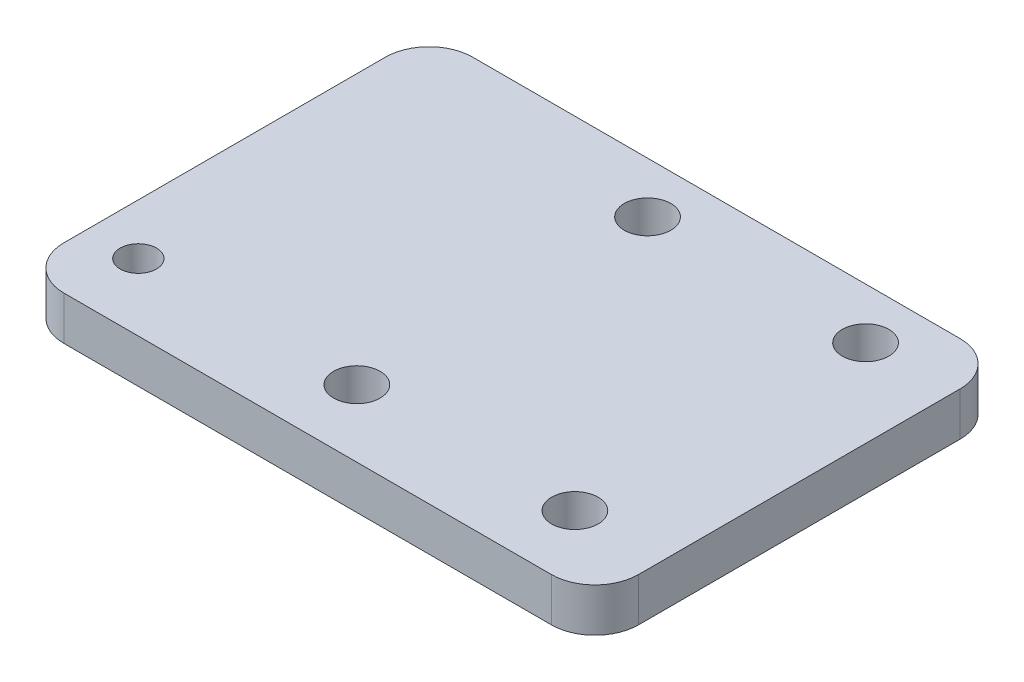
ISO-10303-21;
HEADER;
FILE_DESCRIPTION(('STEP AP214'),'2;1');
FILE_NAME('part.step','',(''),(''),'','','');
FILE_SCHEMA(('AUTOMOTIVE_DESIGN { 1 0 10303 214 1 1 1 1 }'));
ENDSEC;
DATA;
#1=APPLICATION_CONTEXT('core data for automotive mechanical design processes');
#2=APPLICATION_PROTOCOL_DEFINITION('international standard','automotive_design',2000,#1);
#3=PRODUCT_CONTEXT('',#1,'mechanical');
#4=PRODUCT('Part','Part','',(#3));
#5=PRODUCT_RELATED_PRODUCT_CATEGORY('part','',(#4));
#6=PRODUCT_DEFINITION_FORMATION('','',#4);
#7=PRODUCT_DEFINITION_CONTEXT('part definition',#1,'design');
#8=PRODUCT_DEFINITION('design','',#6,#7);
#9=PRODUCT_DEFINITION_SHAPE('','',#8);
#10=(LENGTH_UNIT() NAMED_UNIT(*) SI_UNIT(.MILLI.,.METRE.));
#11=(NAMED_UNIT(*) PLANE_ANGLE_UNIT() SI_UNIT($,.RADIAN.));
#12=(NAMED_UNIT(*) SI_UNIT($,.STERADIAN.) SOLID_ANGLE_UNIT());
#13=UNCERTAINTY_MEASURE_WITH_UNIT(LENGTH_MEASURE(1.E-05),#10,'distance_accuracy_value','');
#14=(GEOMETRIC_REPRESENTATION_CONTEXT(3) GLOBAL_UNCERTAINTY_ASSIGNED_CONTEXT((#13)) GLOBAL_UNIT_ASSIGNED_CONTEXT((#10,
#11,#12)) REPRESENTATION_CONTEXT('',''));
#15=CARTESIAN_POINT('',(0.,0.,0.));
#16=DIRECTION('',(0.,0.,1.));
#17=DIRECTION('',(1.,0.,0.));
#18=AXIS2_PLACEMENT_3D('',#15,#16,#17);
#19=CARTESIAN_POINT('',(10.5,9.05,11.619));
#20=DIRECTION('',(0.,1.,0.));
#21=DIRECTION('',(0.,0.,1.));
#22=AXIS2_PLACEMENT_3D('',#19,#20,#21);
#23=PLANE('',#22);
#24=CARTESIAN_POINT('',(-7.5,9.05,-10.));
#25=DIRECTION('',(0.,1.,0.));
#26=DIRECTION('',(0.,0.,1.));
#27=AXIS2_PLACEMENT_3D('',#24,#25,#26);
#28=CIRCLE('',#27,1.59999999999999);
#29=CARTESIAN_POINT('',(-7.5,9.05,-8.40000000000001));
#30=VERTEX_POINT('',#29);
#31=EDGE_CURVE('E197',#30,#30,#28,.T.);
#32=ORIENTED_EDGE('',*,*,#31,.F.);
#33=EDGE_LOOP('',(#32));
#34=FACE_BOUND('',#33,.T.);
#35=CARTESIAN_POINT('',(-7.5,9.05,10.));
#36=DIRECTION('',(0.,1.,0.));
#37=DIRECTION('',(0.,0.,1.));
#38=AXIS2_PLACEMENT_3D('',#35,#36,#37);
#39=CIRCLE('',#38,1.59999999999999);
#40=CARTESIAN_POINT('',(-7.5,9.05,11.6));
#41=VERTEX_POINT('',#40);
#42=EDGE_CURVE('E185',#41,#41,#39,.T.);
#43=ORIENTED_EDGE('',*,*,#42,.F.);
#44=EDGE_LOOP('',(#43));
#45=FACE_BOUND('',#44,.T.);
#46=CARTESIAN_POINT('',(10.5,9.05,11.619));
#47=DIRECTION('',(0.,1.,0.));
#48=DIRECTION('',(0.,0.,1.));
#49=AXIS2_PLACEMENT_3D('',#46,#47,#48);
#50=CIRCLE('',#49,3.);
#51=CARTESIAN_POINT('',(10.5,9.05,14.619));
#52=VERTEX_POINT('',#51);
#53=CARTESIAN_POINT('',(13.5,9.05,11.619));
#54=VERTEX_POINT('',#53);
#55=EDGE_CURVE('E150',#52,#54,#50,.T.);
#56=ORIENTED_EDGE('',*,*,#55,.T.);
#57=DIRECTION('',(0.,0.,-1.));
#58=VECTOR('',#57,1.);
#59=CARTESIAN_POINT('',(13.5,9.05,11.619));
#60=LINE('',#59,#58);
#61=CARTESIAN_POINT('',(13.4999999999999,9.05,-10.5));
#62=VERTEX_POINT('',#61);
#63=EDGE_CURVE('E94',#54,#62,#60,.T.);
#64=ORIENTED_EDGE('',*,*,#63,.T.);
#65=CARTESIAN_POINT('',(10.5,9.05,-10.5));
#66=DIRECTION('',(0.,1.,0.));
#67=DIRECTION('',(0.,0.,1.));
#68=AXIS2_PLACEMENT_3D('',#65,#66,#67);
#69=CIRCLE('',#68,2.99999999999995);
#70=CARTESIAN_POINT('',(10.5,9.05,-13.4999999999999));
#71=VERTEX_POINT('',#70);
#72=EDGE_CURVE('E165',#62,#71,#69,.T.);
#73=ORIENTED_EDGE('',*,*,#72,.T.);
#74=DIRECTION('',(-1.,0.,0.));
#75=VECTOR('',#74,1.);
#76=CARTESIAN_POINT('',(10.5,9.05,-13.5));
#77=LINE('',#76,#75);
#78=CARTESIAN_POINT('',(-23.0342010096979,9.05,-13.5));
#79=VERTEX_POINT('',#78);
#80=EDGE_CURVE('E176',#71,#79,#77,.T.);
#81=ORIENTED_EDGE('',*,*,#80,.T.);
#82=CARTESIAN_POINT('',(-23.0342010096979,9.05,-10.5));
#83=DIRECTION('',(0.,1.,0.));
#84=DIRECTION('',(0.,0.,1.));
#85=AXIS2_PLACEMENT_3D('',#82,#83,#84);
#86=CIRCLE('',#85,3.);
#87=CARTESIAN_POINT('',(-26.0342010096979,9.05,-10.5));
#88=VERTEX_POINT('',#87);
#89=EDGE_CURVE('E114',#79,#88,#86,.T.);
#90=ORIENTED_EDGE('',*,*,#89,.T.);
#91=DIRECTION('',(0.,0.,1.));
#92=VECTOR('',#91,1.);
#93=CARTESIAN_POINT('',(-26.0342010096979,9.05,-10.5));
#94=LINE('',#93,#92);
#95=CARTESIAN_POINT('',(-26.0342010096979,9.05,11.619));
#96=VERTEX_POINT('',#95);
#97=EDGE_CURVE('E107',#88,#96,#94,.T.);
#98=ORIENTED_EDGE('',*,*,#97,.T.);
#99=CARTESIAN_POINT('',(-23.0342010096979,9.05,11.619));
#100=DIRECTION('',(0.,1.,0.));
#101=DIRECTION('',(0.,0.,1.));
#102=AXIS2_PLACEMENT_3D('',#99,#100,#101);
#103=CIRCLE('',#102,3.);
#104=CARTESIAN_POINT('',(-23.0342010096979,9.05,14.619));
#105=VERTEX_POINT('',#104);
#106=EDGE_CURVE('E111',#96,#105,#103,.T.);
#107=ORIENTED_EDGE('',*,*,#106,.T.);
#108=DIRECTION('',(1.,0.,0.));
#109=VECTOR('',#108,1.);
#110=CARTESIAN_POINT('',(-23.0342010096979,9.05,14.619));
#111=LINE('',#110,#109);
#112=EDGE_CURVE('E53',#105,#52,#111,.T.);
#113=ORIENTED_EDGE('',*,*,#112,.T.);
#114=EDGE_LOOP('',(#56,#64,#73,#81,#90,#98,#107,#113));
#115=FACE_BOUND('',#114,.T.);
#116=CARTESIAN_POINT('',(7.5,9.05,10.));
#117=DIRECTION('',(0.,1.,0.));
#118=DIRECTION('',(0.,0.,1.));
#119=AXIS2_PLACEMENT_3D('',#116,#117,#118);
#120=CIRCLE('',#119,1.59999999999999);
#121=CARTESIAN_POINT('',(7.5,9.05,11.6));
#122=VERTEX_POINT('',#121);
#123=EDGE_CURVE('E138',#122,#122,#120,.T.);
#124=ORIENTED_EDGE('',*,*,#123,.F.);
#125=EDGE_LOOP('',(#124));
#126=FACE_BOUND('',#125,.T.);
#127=CARTESIAN_POINT('',(7.5,9.05,-10.));
#128=DIRECTION('',(0.,1.,0.));
#129=DIRECTION('',(0.,0.,1.));
#130=AXIS2_PLACEMENT_3D('',#127,#128,#129);
#131=CIRCLE('',#130,1.59999999999999);
#132=CARTESIAN_POINT('',(7.5,9.05,-8.40000000000001));
#133=VERTEX_POINT('',#132);
#134=EDGE_CURVE('E191',#133,#133,#131,.T.);
#135=ORIENTED_EDGE('',*,*,#134,.F.);
#136=EDGE_LOOP('',(#135));
#137=FACE_BOUND('',#136,.T.);
#138=CARTESIAN_POINT('',(-22.5342010096979,9.05,10.));
#139=DIRECTION('',(0.,1.,0.));
#140=DIRECTION('',(0.,0.,1.));
#141=AXIS2_PLACEMENT_3D('',#138,#139,#140);
#142=CIRCLE('',#141,1.25);
#143=CARTESIAN_POINT('',(-22.5342010096979,9.05,11.25));
#144=VERTEX_POINT('',#143);
#145=EDGE_CURVE('E203',#144,#144,#142,.T.);
#146=ORIENTED_EDGE('',*,*,#145,.F.);
#147=EDGE_LOOP('',(#146));
#148=FACE_BOUND('',#147,.T.);
#149=ADVANCED_FACE('F36',(#34,#45,#115,#126,#137,#148),#23,.T.);
#150=CARTESIAN_POINT('',(10.5,6.05,11.619));
#151=DIRECTION('',(0.,1.,0.));
#152=DIRECTION('',(0.,0.,1.));
#153=AXIS2_PLACEMENT_3D('',#150,#151,#152);
#154=PLANE('',#153);
#155=CARTESIAN_POINT('',(10.5,6.05,11.619));
#156=DIRECTION('',(0.,1.,0.));
#157=DIRECTION('',(0.,0.,1.));
#158=AXIS2_PLACEMENT_3D('',#155,#156,#157);
#159=CIRCLE('',#158,3.);
#160=CARTESIAN_POINT('',(10.5,6.05,14.619));
#161=VERTEX_POINT('',#160);
#162=CARTESIAN_POINT('',(13.5,6.05,11.619));
#163=VERTEX_POINT('',#162);
#164=EDGE_CURVE('E134',#161,#163,#159,.T.);
#165=ORIENTED_EDGE('',*,*,#164,.F.);
#166=DIRECTION('',(1.,0.,0.));
#167=VECTOR('',#166,1.);
#168=CARTESIAN_POINT('',(-22.8915808263262,6.05,14.619));
#169=LINE('',#168,#167);
#170=CARTESIAN_POINT('',(-23.0342010096979,6.05,14.619));
#171=VERTEX_POINT('',#170);
#172=EDGE_CURVE('E82',#171,#161,#169,.T.);
#173=ORIENTED_EDGE('',*,*,#172,.F.);
#174=CARTESIAN_POINT('',(-23.0342010096979,6.05,11.619));
#175=DIRECTION('',(0.,1.,0.));
#176=DIRECTION('',(0.,0.,1.));
#177=AXIS2_PLACEMENT_3D('',#174,#175,#176);
#178=CIRCLE('',#177,3.);
#179=CARTESIAN_POINT('',(-26.0342010096979,6.05,11.619));
#180=VERTEX_POINT('',#179);
#181=EDGE_CURVE('E147',#180,#171,#178,.T.);
#182=ORIENTED_EDGE('',*,*,#181,.F.);
#183=DIRECTION('',(0.,0.,1.));
#184=VECTOR('',#183,1.);
#185=CARTESIAN_POINT('',(-26.0342010096979,6.05,-10.5));
#186=LINE('',#185,#184);
#187=CARTESIAN_POINT('',(-26.0342010096979,6.05,-10.5));
#188=VERTEX_POINT('',#187);
#189=EDGE_CURVE('E123',#188,#180,#186,.T.);
#190=ORIENTED_EDGE('',*,*,#189,.F.);
#191=CARTESIAN_POINT('',(-23.0342010096979,6.05,-10.5));
#192=DIRECTION('',(0.,1.,0.));
#193=DIRECTION('',(0.,0.,1.));
#194=AXIS2_PLACEMENT_3D('',#191,#192,#193);
#195=CIRCLE('',#194,3.);
#196=CARTESIAN_POINT('',(-23.0342010096979,6.05,-13.5));
#197=VERTEX_POINT('',#196);
#198=EDGE_CURVE('E144',#197,#188,#195,.T.);
#199=ORIENTED_EDGE('',*,*,#198,.F.);
#200=DIRECTION('',(-1.,0.,0.));
#201=VECTOR('',#200,1.);
#202=CARTESIAN_POINT('',(10.5,6.05,-13.5));
#203=LINE('',#202,#201);
#204=CARTESIAN_POINT('',(10.5,6.05,-13.4999999999999));
#205=VERTEX_POINT('',#204);
#206=EDGE_CURVE('E142',#205,#197,#203,.T.);
#207=ORIENTED_EDGE('',*,*,#206,.F.);
#208=CARTESIAN_POINT('',(10.5,6.05,-10.5));
#209=DIRECTION('',(0.,1.,0.));
#210=DIRECTION('',(0.,0.,1.));
#211=AXIS2_PLACEMENT_3D('',#208,#209,#210);
#212=CIRCLE('',#211,2.99999999999995);
#213=CARTESIAN_POINT('',(13.4999999999999,6.05,-10.5));
#214=VERTEX_POINT('',#213);
#215=EDGE_CURVE('E140',#214,#205,#212,.T.);
#216=ORIENTED_EDGE('',*,*,#215,.F.);
#217=DIRECTION('',(0.,0.,-1.));
#218=VECTOR('',#217,1.);
#219=CARTESIAN_POINT('',(13.5,6.05,11.619));
#220=LINE('',#219,#218);
#221=EDGE_CURVE('E137',#163,#214,#220,.T.);
#222=ORIENTED_EDGE('',*,*,#221,.F.);
#223=EDGE_LOOP('',(#165,#173,#182,#190,#199,#207,#216,#222));
#224=FACE_BOUND('',#223,.T.);
#225=CARTESIAN_POINT('',(7.5,6.05,10.));
#226=DIRECTION('',(0.,1.,0.));
#227=DIRECTION('',(0.,0.,1.));
#228=AXIS2_PLACEMENT_3D('',#225,#226,#227);
#229=CIRCLE('',#228,1.59999999999999);
#230=CARTESIAN_POINT('',(7.5,6.05,11.6));
#231=VERTEX_POINT('',#230);
#232=EDGE_CURVE('E182',#231,#231,#229,.T.);
#233=ORIENTED_EDGE('',*,*,#232,.T.);
#234=EDGE_LOOP('',(#233));
#235=FACE_BOUND('',#234,.T.);
#236=CARTESIAN_POINT('',(-7.5,6.05,10.));
#237=DIRECTION('',(0.,1.,0.));
#238=DIRECTION('',(0.,0.,1.));
#239=AXIS2_PLACEMENT_3D('',#236,#237,#238);
#240=CIRCLE('',#239,1.59999999999999);
#241=CARTESIAN_POINT('',(-7.5,6.05,11.6));
#242=VERTEX_POINT('',#241);
#243=EDGE_CURVE('E188',#242,#242,#240,.T.);
#244=ORIENTED_EDGE('',*,*,#243,.T.);
#245=EDGE_LOOP('',(#244));
#246=FACE_BOUND('',#245,.T.);
#247=CARTESIAN_POINT('',(7.5,6.05,-10.));
#248=DIRECTION('',(0.,1.,0.));
#249=DIRECTION('',(0.,0.,1.));
#250=AXIS2_PLACEMENT_3D('',#247,#248,#249);
#251=CIRCLE('',#250,1.59999999999999);
#252=CARTESIAN_POINT('',(7.5,6.05,-8.40000000000001));
#253=VERTEX_POINT('',#252);
#254=EDGE_CURVE('E194',#253,#253,#251,.T.);
#255=ORIENTED_EDGE('',*,*,#254,.T.);
#256=EDGE_LOOP('',(#255));
#257=FACE_BOUND('',#256,.T.);
#258=CARTESIAN_POINT('',(-7.5,6.05,-10.));
#259=DIRECTION('',(0.,1.,0.));
#260=DIRECTION('',(0.,0.,1.));
#261=AXIS2_PLACEMENT_3D('',#258,#259,#260);
#262=CIRCLE('',#261,1.59999999999999);
#263=CARTESIAN_POINT('',(-7.5,6.05,-8.40000000000001));
#264=VERTEX_POINT('',#263);
#265=EDGE_CURVE('E200',#264,#264,#262,.T.);
#266=ORIENTED_EDGE('',*,*,#265,.T.);
#267=EDGE_LOOP('',(#266));
#268=FACE_BOUND('',#267,.T.);
#269=CARTESIAN_POINT('',(-22.5342010096979,6.05,10.));
#270=DIRECTION('',(0.,1.,0.));
#271=DIRECTION('',(0.,0.,1.));
#272=AXIS2_PLACEMENT_3D('',#269,#270,#271);
#273=CIRCLE('',#272,1.25);
#274=CARTESIAN_POINT('',(-22.5342010096979,6.05,11.25));
#275=VERTEX_POINT('',#274);
#276=EDGE_CURVE('E206',#275,#275,#273,.T.);
#277=ORIENTED_EDGE('',*,*,#276,.T.);
#278=EDGE_LOOP('',(#277));
#279=FACE_BOUND('',#278,.T.);
#280=ADVANCED_FACE('F167',(#224,#235,#246,#257,#268,#279),#154,.F.);
#281=CARTESIAN_POINT('',(10.5,9.05,11.619));
#282=DIRECTION('',(0.,-1.,0.));
#283=DIRECTION('',(0.,0.,-1.));
#284=AXIS2_PLACEMENT_3D('',#281,#282,#283);
#285=CYLINDRICAL_SURFACE('',#284,3.);
#286=ORIENTED_EDGE('',*,*,#164,.T.);
#287=DIRECTION('',(0.,-1.,0.));
#288=VECTOR('',#287,1.);
#289=CARTESIAN_POINT('',(13.5,9.05,11.619));
#290=LINE('',#289,#288);
#291=EDGE_CURVE('E11',#54,#163,#290,.T.);
#292=ORIENTED_EDGE('',*,*,#291,.F.);
#293=ORIENTED_EDGE('',*,*,#55,.F.);
#294=DIRECTION('',(0.,-1.,0.));
#295=VECTOR('',#294,1.);
#296=CARTESIAN_POINT('',(10.5,9.05,14.619));
#297=LINE('',#296,#295);
#298=EDGE_CURVE('E130',#52,#161,#297,.T.);
#299=ORIENTED_EDGE('',*,*,#298,.T.);
#300=EDGE_LOOP('',(#286,#292,#293,#299));
#301=FACE_BOUND('',#300,.T.);
#302=ADVANCED_FACE('F38',(#301),#285,.T.);
#303=CARTESIAN_POINT('',(13.5,9.05,11.619));
#304=DIRECTION('',(-1.,0.,0.));
#305=DIRECTION('',(0.,0.,1.));
#306=AXIS2_PLACEMENT_3D('',#303,#304,#305);
#307=PLANE('',#306);
#308=ORIENTED_EDGE('',*,*,#221,.T.);
#309=DIRECTION('',(0.,-1.,0.));
#310=VECTOR('',#309,1.);
#311=CARTESIAN_POINT('',(13.4999999999999,9.05,-10.5));
#312=LINE('',#311,#310);
#313=EDGE_CURVE('E45',#62,#214,#312,.T.);
#314=ORIENTED_EDGE('',*,*,#313,.F.);
#315=ORIENTED_EDGE('',*,*,#63,.F.);
#316=ORIENTED_EDGE('',*,*,#291,.T.);
#317=EDGE_LOOP('',(#308,#314,#315,#316));
#318=FACE_BOUND('',#317,.T.);
#319=ADVANCED_FACE('F240',(#318),#307,.F.);
#320=CARTESIAN_POINT('',(10.5,9.05,-10.5));
#321=DIRECTION('',(0.,-1.,0.));
#322=DIRECTION('',(0.,0.,-1.));
#323=AXIS2_PLACEMENT_3D('',#320,#321,#322);
#324=CYLINDRICAL_SURFACE('',#323,2.99999999999995);
#325=ORIENTED_EDGE('',*,*,#215,.T.);
#326=DIRECTION('',(0.,-1.,0.));
#327=VECTOR('',#326,1.);
#328=CARTESIAN_POINT('',(10.5,9.05,-13.4999999999999));
#329=LINE('',#328,#327);
#330=EDGE_CURVE('E157',#71,#205,#329,.T.);
#331=ORIENTED_EDGE('',*,*,#330,.F.);
#332=ORIENTED_EDGE('',*,*,#72,.F.);
#333=ORIENTED_EDGE('',*,*,#313,.T.);
#334=EDGE_LOOP('',(#325,#331,#332,#333));
#335=FACE_BOUND('',#334,.T.);
#336=ADVANCED_FACE('F163',(#335),#324,.T.);
#337=CARTESIAN_POINT('',(10.5,9.05,-13.5));
#338=DIRECTION('',(0.,0.,1.));
#339=DIRECTION('',(1.,0.,0.));
#340=AXIS2_PLACEMENT_3D('',#337,#338,#339);
#341=PLANE('',#340);
#342=ORIENTED_EDGE('',*,*,#206,.T.);
#343=DIRECTION('',(0.,-1.,0.));
#344=VECTOR('',#343,1.);
#345=CARTESIAN_POINT('',(-23.0342010096979,9.05,-13.5));
#346=LINE('',#345,#344);
#347=EDGE_CURVE('E154',#79,#197,#346,.T.);
#348=ORIENTED_EDGE('',*,*,#347,.F.);
#349=ORIENTED_EDGE('',*,*,#80,.F.);
#350=ORIENTED_EDGE('',*,*,#330,.T.);
#351=EDGE_LOOP('',(#342,#348,#349,#350));
#352=FACE_BOUND('',#351,.T.);
#353=ADVANCED_FACE('F172',(#352),#341,.F.);
#354=CARTESIAN_POINT('',(-23.0342010096979,9.05,-10.5));
#355=DIRECTION('',(0.,-1.,0.));
#356=DIRECTION('',(0.,0.,-1.));
#357=AXIS2_PLACEMENT_3D('',#354,#355,#356);
#358=CYLINDRICAL_SURFACE('',#357,3.);
#359=ORIENTED_EDGE('',*,*,#198,.T.);
#360=DIRECTION('',(0.,-1.,0.));
#361=VECTOR('',#360,1.);
#362=CARTESIAN_POINT('',(-26.0342010096979,9.05,-10.5));
#363=LINE('',#362,#361);
#364=EDGE_CURVE('E125',#88,#188,#363,.T.);
#365=ORIENTED_EDGE('',*,*,#364,.F.);
#366=ORIENTED_EDGE('',*,*,#89,.F.);
#367=ORIENTED_EDGE('',*,*,#347,.T.);
#368=EDGE_LOOP('',(#359,#365,#366,#367));
#369=FACE_BOUND('',#368,.T.);
#370=ADVANCED_FACE('F175',(#369),#358,.T.);
#371=CARTESIAN_POINT('',(-26.0342010096979,9.05,-10.5));
#372=DIRECTION('',(1.,0.,0.));
#373=DIRECTION('',(0.,0.,-1.));
#374=AXIS2_PLACEMENT_3D('',#371,#372,#373);
#375=PLANE('',#374);
#376=ORIENTED_EDGE('',*,*,#189,.T.);
#377=DIRECTION('',(0.,-1.,0.));
#378=VECTOR('',#377,1.);
#379=CARTESIAN_POINT('',(-26.0342010096979,9.05,11.619));
#380=LINE('',#379,#378);
#381=EDGE_CURVE('E120',#96,#180,#380,.T.);
#382=ORIENTED_EDGE('',*,*,#381,.F.);
#383=ORIENTED_EDGE('',*,*,#97,.F.);
#384=ORIENTED_EDGE('',*,*,#364,.T.);
#385=EDGE_LOOP('',(#376,#382,#383,#384));
#386=FACE_BOUND('',#385,.T.);
#387=ADVANCED_FACE('F121',(#386),#375,.F.);
#388=CARTESIAN_POINT('',(-23.0342010096979,9.05,11.619));
#389=DIRECTION('',(0.,-1.,0.));
#390=DIRECTION('',(0.,0.,-1.));
#391=AXIS2_PLACEMENT_3D('',#388,#389,#390);
#392=CYLINDRICAL_SURFACE('',#391,3.);
#393=ORIENTED_EDGE('',*,*,#181,.T.);
#394=DIRECTION('',(0.,-1.,0.));
#395=VECTOR('',#394,1.);
#396=CARTESIAN_POINT('',(-23.0342010096979,9.05,14.619));
#397=LINE('',#396,#395);
#398=EDGE_CURVE('E126',#105,#171,#397,.T.);
#399=ORIENTED_EDGE('',*,*,#398,.F.);
#400=ORIENTED_EDGE('',*,*,#106,.F.);
#401=ORIENTED_EDGE('',*,*,#381,.T.);
#402=EDGE_LOOP('',(#393,#399,#400,#401));
#403=FACE_BOUND('',#402,.T.);
#404=ADVANCED_FACE('F128',(#403),#392,.T.);
#405=CARTESIAN_POINT('',(-22.8915808263262,9.05,14.619));
#406=DIRECTION('',(0.,0.,-1.));
#407=DIRECTION('',(-1.,0.,0.));
#408=AXIS2_PLACEMENT_3D('',#405,#406,#407);
#409=PLANE('',#408);
#410=ORIENTED_EDGE('',*,*,#172,.T.);
#411=ORIENTED_EDGE('',*,*,#298,.F.);
#412=ORIENTED_EDGE('',*,*,#112,.F.);
#413=ORIENTED_EDGE('',*,*,#398,.T.);
#414=EDGE_LOOP('',(#410,#411,#412,#413));
#415=FACE_BOUND('',#414,.T.);
#416=ADVANCED_FACE('F228',(#415),#409,.F.);
#417=CARTESIAN_POINT('',(7.5,9.05,10.));
#418=DIRECTION('',(0.,-1.,0.));
#419=DIRECTION('',(0.,0.,-1.));
#420=AXIS2_PLACEMENT_3D('',#417,#418,#419);
#421=CYLINDRICAL_SURFACE('',#420,1.59999999999999);
#422=ORIENTED_EDGE('',*,*,#123,.T.);
#423=EDGE_LOOP('',(#422));
#424=FACE_BOUND('',#423,.T.);
#425=ORIENTED_EDGE('',*,*,#232,.F.);
#426=EDGE_LOOP('',(#425));
#427=FACE_BOUND('',#426,.T.);
#428=ADVANCED_FACE('F225',(#424,#427),#421,.F.);
#429=CARTESIAN_POINT('',(-7.5,9.05,10.));
#430=DIRECTION('',(0.,-1.,0.));
#431=DIRECTION('',(0.,0.,-1.));
#432=AXIS2_PLACEMENT_3D('',#429,#430,#431);
#433=CYLINDRICAL_SURFACE('',#432,1.59999999999999);
#434=ORIENTED_EDGE('',*,*,#42,.T.);
#435=EDGE_LOOP('',(#434));
#436=FACE_BOUND('',#435,.T.);
#437=ORIENTED_EDGE('',*,*,#243,.F.);
#438=EDGE_LOOP('',(#437));
#439=FACE_BOUND('',#438,.T.);
#440=ADVANCED_FACE('F309',(#436,#439),#433,.F.);
#441=CARTESIAN_POINT('',(7.5,9.05,-10.));
#442=DIRECTION('',(0.,-1.,0.));
#443=DIRECTION('',(0.,0.,-1.));
#444=AXIS2_PLACEMENT_3D('',#441,#442,#443);
#445=CYLINDRICAL_SURFACE('',#444,1.59999999999999);
#446=ORIENTED_EDGE('',*,*,#134,.T.);
#447=EDGE_LOOP('',(#446));
#448=FACE_BOUND('',#447,.T.);
#449=ORIENTED_EDGE('',*,*,#254,.F.);
#450=EDGE_LOOP('',(#449));
#451=FACE_BOUND('',#450,.T.);
#452=ADVANCED_FACE('F317',(#448,#451),#445,.F.);
#453=CARTESIAN_POINT('',(-7.5,9.05,-10.));
#454=DIRECTION('',(0.,-1.,0.));
#455=DIRECTION('',(0.,0.,-1.));
#456=AXIS2_PLACEMENT_3D('',#453,#454,#455);
#457=CYLINDRICAL_SURFACE('',#456,1.59999999999999);
#458=ORIENTED_EDGE('',*,*,#31,.T.);
#459=EDGE_LOOP('',(#458));
#460=FACE_BOUND('',#459,.T.);
#461=ORIENTED_EDGE('',*,*,#265,.F.);
#462=EDGE_LOOP('',(#461));
#463=FACE_BOUND('',#462,.T.);
#464=ADVANCED_FACE('F325',(#460,#463),#457,.F.);
#465=CARTESIAN_POINT('',(-22.5342010096979,9.05,10.));
#466=DIRECTION('',(0.,-1.,0.));
#467=DIRECTION('',(0.,0.,-1.));
#468=AXIS2_PLACEMENT_3D('',#465,#466,#467);
#469=CYLINDRICAL_SURFACE('',#468,1.25);
#470=ORIENTED_EDGE('',*,*,#145,.T.);
#471=EDGE_LOOP('',(#470));
#472=FACE_BOUND('',#471,.T.);
#473=ORIENTED_EDGE('',*,*,#276,.F.);
#474=EDGE_LOOP('',(#473));
#475=FACE_BOUND('',#474,.T.);
#476=ADVANCED_FACE('F212',(#472,#475),#469,.F.);
#477=CLOSED_SHELL('',(#149,#280,#302,#319,#336,#353,#370,#387,#404,#416,#428,#440,#452,#464,#476));
#478=MANIFOLD_SOLID_BREP('B2',#477);
#479=ADVANCED_BREP_SHAPE_REPRESENTATION('',(#18,#478),#14);
#480=SHAPE_DEFINITION_REPRESENTATION(#9,#479);
ENDSEC;
END-ISO-10303-21;
